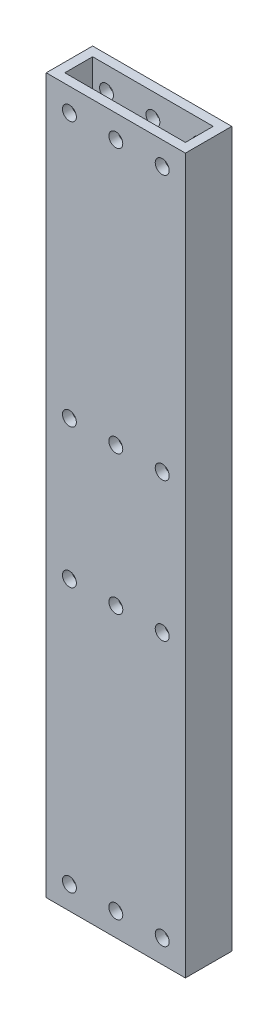
ISO-10303-21;
HEADER;
FILE_DESCRIPTION(('STEP AP214'),'2;1');
FILE_NAME('part.step','',(''),(''),'','','');
FILE_SCHEMA(('AUTOMOTIVE_DESIGN { 1 0 10303 214 1 1 1 1 }'));
ENDSEC;
DATA;
#1=APPLICATION_CONTEXT('core data for automotive mechanical design processes');
#2=APPLICATION_PROTOCOL_DEFINITION('international standard','automotive_design',2000,#1);
#3=PRODUCT_CONTEXT('',#1,'mechanical');
#4=PRODUCT('Part','Part','',(#3));
#5=PRODUCT_RELATED_PRODUCT_CATEGORY('part','',(#4));
#6=PRODUCT_DEFINITION_FORMATION('','',#4);
#7=PRODUCT_DEFINITION_CONTEXT('part definition',#1,'design');
#8=PRODUCT_DEFINITION('design','',#6,#7);
#9=PRODUCT_DEFINITION_SHAPE('','',#8);
#10=(LENGTH_UNIT() NAMED_UNIT(*) SI_UNIT(.MILLI.,.METRE.));
#11=(NAMED_UNIT(*) PLANE_ANGLE_UNIT() SI_UNIT($,.RADIAN.));
#12=(NAMED_UNIT(*) SI_UNIT($,.STERADIAN.) SOLID_ANGLE_UNIT());
#13=UNCERTAINTY_MEASURE_WITH_UNIT(LENGTH_MEASURE(1.E-05),#10,'distance_accuracy_value','');
#14=(GEOMETRIC_REPRESENTATION_CONTEXT(3) GLOBAL_UNCERTAINTY_ASSIGNED_CONTEXT((#13)) GLOBAL_UNIT_ASSIGNED_CONTEXT((#10,
#11,#12)) REPRESENTATION_CONTEXT('',''));
#15=CARTESIAN_POINT('',(0.,0.,0.));
#16=DIRECTION('',(0.,0.,1.));
#17=DIRECTION('',(1.,0.,0.));
#18=AXIS2_PLACEMENT_3D('',#15,#16,#17);
#19=CARTESIAN_POINT('',(0.,77.,0.));
#20=DIRECTION('',(0.,1.,0.));
#21=DIRECTION('',(0.,0.,1.));
#22=AXIS2_PLACEMENT_3D('',#19,#20,#21);
#23=PLANE('',#22);
#24=DIRECTION('',(0.,0.,-1.));
#25=VECTOR('',#24,1.);
#26=CARTESIAN_POINT('',(15.,77.,-5.));
#27=LINE('',#26,#25);
#28=CARTESIAN_POINT('',(15.,77.,5.));
#29=VERTEX_POINT('',#28);
#30=CARTESIAN_POINT('',(15.,77.,-5.));
#31=VERTEX_POINT('',#30);
#32=EDGE_CURVE('E156',#29,#31,#27,.T.);
#33=ORIENTED_EDGE('',*,*,#32,.T.);
#34=DIRECTION('',(-1.,0.,0.));
#35=VECTOR('',#34,1.);
#36=CARTESIAN_POINT('',(-15.,77.,-5.));
#37=LINE('',#36,#35);
#38=CARTESIAN_POINT('',(-15.,77.,-5.));
#39=VERTEX_POINT('',#38);
#40=EDGE_CURVE('E160',#31,#39,#37,.T.);
#41=ORIENTED_EDGE('',*,*,#40,.T.);
#42=DIRECTION('',(0.,0.,1.));
#43=VECTOR('',#42,1.);
#44=CARTESIAN_POINT('',(-15.,77.,-5.));
#45=LINE('',#44,#43);
#46=CARTESIAN_POINT('',(-15.,77.,5.));
#47=VERTEX_POINT('',#46);
#48=EDGE_CURVE('E164',#39,#47,#45,.T.);
#49=ORIENTED_EDGE('',*,*,#48,.T.);
#50=DIRECTION('',(1.,0.,0.));
#51=VECTOR('',#50,1.);
#52=CARTESIAN_POINT('',(-15.,77.,5.));
#53=LINE('',#52,#51);
#54=EDGE_CURVE('E167',#47,#29,#53,.T.);
#55=ORIENTED_EDGE('',*,*,#54,.T.);
#56=EDGE_LOOP('',(#33,#41,#49,#55));
#57=FACE_BOUND('',#56,.T.);
#58=DIRECTION('',(-1.,0.,0.));
#59=VECTOR('',#58,1.);
#60=CARTESIAN_POINT('',(-13.,77.,-3.));
#61=LINE('',#60,#59);
#62=CARTESIAN_POINT('',(13.,77.,-3.));
#63=VERTEX_POINT('',#62);
#64=CARTESIAN_POINT('',(-13.,77.,-3.));
#65=VERTEX_POINT('',#64);
#66=EDGE_CURVE('E115',#63,#65,#61,.T.);
#67=ORIENTED_EDGE('',*,*,#66,.F.);
#68=DIRECTION('',(0.,0.,-1.));
#69=VECTOR('',#68,1.);
#70=CARTESIAN_POINT('',(13.,77.,-3.));
#71=LINE('',#70,#69);
#72=CARTESIAN_POINT('',(13.,77.,3.));
#73=VERTEX_POINT('',#72);
#74=EDGE_CURVE('E106',#73,#63,#71,.T.);
#75=ORIENTED_EDGE('',*,*,#74,.F.);
#76=DIRECTION('',(1.,0.,0.));
#77=VECTOR('',#76,1.);
#78=CARTESIAN_POINT('',(-13.,77.,3.));
#79=LINE('',#78,#77);
#80=CARTESIAN_POINT('',(-13.,77.,3.));
#81=VERTEX_POINT('',#80);
#82=EDGE_CURVE('E132',#81,#73,#79,.T.);
#83=ORIENTED_EDGE('',*,*,#82,.F.);
#84=DIRECTION('',(0.,0.,1.));
#85=VECTOR('',#84,1.);
#86=CARTESIAN_POINT('',(-13.,77.,-3.));
#87=LINE('',#86,#85);
#88=EDGE_CURVE('E128',#65,#81,#87,.T.);
#89=ORIENTED_EDGE('',*,*,#88,.F.);
#90=EDGE_LOOP('',(#67,#75,#83,#89));
#91=FACE_BOUND('',#90,.T.);
#92=ADVANCED_FACE('F38',(#57,#91),#23,.T.);
#93=CARTESIAN_POINT('',(0.,-77.,0.));
#94=DIRECTION('',(0.,1.,0.));
#95=DIRECTION('',(0.,0.,1.));
#96=AXIS2_PLACEMENT_3D('',#93,#94,#95);
#97=PLANE('',#96);
#98=DIRECTION('',(0.,0.,-1.));
#99=VECTOR('',#98,1.);
#100=CARTESIAN_POINT('',(15.,-77.,-5.));
#101=LINE('',#100,#99);
#102=CARTESIAN_POINT('',(15.,-77.,5.));
#103=VERTEX_POINT('',#102);
#104=CARTESIAN_POINT('',(15.,-77.,-5.));
#105=VERTEX_POINT('',#104);
#106=EDGE_CURVE('E124',#103,#105,#101,.T.);
#107=ORIENTED_EDGE('',*,*,#106,.F.);
#108=DIRECTION('',(1.,0.,0.));
#109=VECTOR('',#108,1.);
#110=CARTESIAN_POINT('',(-15.,-77.,5.));
#111=LINE('',#110,#109);
#112=CARTESIAN_POINT('',(-15.,-77.,5.));
#113=VERTEX_POINT('',#112);
#114=EDGE_CURVE('E161',#113,#103,#111,.T.);
#115=ORIENTED_EDGE('',*,*,#114,.F.);
#116=DIRECTION('',(0.,0.,1.));
#117=VECTOR('',#116,1.);
#118=CARTESIAN_POINT('',(-15.,-77.,-5.));
#119=LINE('',#118,#117);
#120=CARTESIAN_POINT('',(-15.,-77.,-5.));
#121=VERTEX_POINT('',#120);
#122=EDGE_CURVE('E177',#121,#113,#119,.T.);
#123=ORIENTED_EDGE('',*,*,#122,.F.);
#124=DIRECTION('',(-1.,0.,0.));
#125=VECTOR('',#124,1.);
#126=CARTESIAN_POINT('',(-15.,-77.,-5.));
#127=LINE('',#126,#125);
#128=EDGE_CURVE('E174',#105,#121,#127,.T.);
#129=ORIENTED_EDGE('',*,*,#128,.F.);
#130=EDGE_LOOP('',(#107,#115,#123,#129));
#131=FACE_BOUND('',#130,.T.);
#132=DIRECTION('',(0.,0.,-1.));
#133=VECTOR('',#132,1.);
#134=CARTESIAN_POINT('',(13.,-77.,-3.));
#135=LINE('',#134,#133);
#136=CARTESIAN_POINT('',(13.,-77.,3.));
#137=VERTEX_POINT('',#136);
#138=CARTESIAN_POINT('',(13.,-77.,-3.));
#139=VERTEX_POINT('',#138);
#140=EDGE_CURVE('E64',#137,#139,#135,.T.);
#141=ORIENTED_EDGE('',*,*,#140,.T.);
#142=DIRECTION('',(-1.,0.,0.));
#143=VECTOR('',#142,1.);
#144=CARTESIAN_POINT('',(-13.,-77.,-3.));
#145=LINE('',#144,#143);
#146=CARTESIAN_POINT('',(-13.,-77.,-3.));
#147=VERTEX_POINT('',#146);
#148=EDGE_CURVE('E122',#139,#147,#145,.T.);
#149=ORIENTED_EDGE('',*,*,#148,.T.);
#150=DIRECTION('',(0.,0.,1.));
#151=VECTOR('',#150,1.);
#152=CARTESIAN_POINT('',(-13.,-77.,-3.));
#153=LINE('',#152,#151);
#154=CARTESIAN_POINT('',(-13.,-77.,3.));
#155=VERTEX_POINT('',#154);
#156=EDGE_CURVE('E143',#147,#155,#153,.T.);
#157=ORIENTED_EDGE('',*,*,#156,.T.);
#158=DIRECTION('',(1.,0.,0.));
#159=VECTOR('',#158,1.);
#160=CARTESIAN_POINT('',(-13.,-77.,3.));
#161=LINE('',#160,#159);
#162=EDGE_CURVE('E116',#155,#137,#161,.T.);
#163=ORIENTED_EDGE('',*,*,#162,.T.);
#164=EDGE_LOOP('',(#141,#149,#157,#163));
#165=FACE_BOUND('',#164,.T.);
#166=ADVANCED_FACE('F297',(#131,#165),#97,.F.);
#167=CARTESIAN_POINT('',(15.,77.,-5.));
#168=DIRECTION('',(-1.,0.,0.));
#169=DIRECTION('',(0.,0.,1.));
#170=AXIS2_PLACEMENT_3D('',#167,#168,#169);
#171=PLANE('',#170);
#172=ORIENTED_EDGE('',*,*,#106,.T.);
#173=DIRECTION('',(0.,-1.,0.));
#174=VECTOR('',#173,1.);
#175=CARTESIAN_POINT('',(15.,77.,-5.));
#176=LINE('',#175,#174);
#177=EDGE_CURVE('E11',#31,#105,#176,.T.);
#178=ORIENTED_EDGE('',*,*,#177,.F.);
#179=ORIENTED_EDGE('',*,*,#32,.F.);
#180=DIRECTION('',(0.,-1.,0.));
#181=VECTOR('',#180,1.);
#182=CARTESIAN_POINT('',(15.,77.,5.));
#183=LINE('',#182,#181);
#184=EDGE_CURVE('E170',#29,#103,#183,.T.);
#185=ORIENTED_EDGE('',*,*,#184,.T.);
#186=EDGE_LOOP('',(#172,#178,#179,#185));
#187=FACE_BOUND('',#186,.T.);
#188=ADVANCED_FACE('F40',(#187),#171,.F.);
#189=CARTESIAN_POINT('',(-15.,77.,-5.));
#190=DIRECTION('',(0.,0.,1.));
#191=DIRECTION('',(1.,0.,0.));
#192=AXIS2_PLACEMENT_3D('',#189,#190,#191);
#193=PLANE('',#192);
#194=CARTESIAN_POINT('',(10.,-72.,-5.));
#195=DIRECTION('',(0.,0.,1.));
#196=DIRECTION('',(-1.,0.,0.));
#197=AXIS2_PLACEMENT_3D('',#194,#195,#196);
#198=CIRCLE('',#197,1.5);
#199=CARTESIAN_POINT('',(8.5,-72.,-5.));
#200=VERTEX_POINT('',#199);
#201=EDGE_CURVE('E335',#200,#200,#198,.T.);
#202=ORIENTED_EDGE('',*,*,#201,.T.);
#203=EDGE_LOOP('',(#202));
#204=FACE_BOUND('',#203,.T.);
#205=CARTESIAN_POINT('',(0.,-72.,-5.));
#206=DIRECTION('',(0.,0.,1.));
#207=DIRECTION('',(-1.,0.,0.));
#208=AXIS2_PLACEMENT_3D('',#205,#206,#207);
#209=CIRCLE('',#208,1.5);
#210=CARTESIAN_POINT('',(-1.5,-72.,-5.));
#211=VERTEX_POINT('',#210);
#212=EDGE_CURVE('E339',#211,#211,#209,.T.);
#213=ORIENTED_EDGE('',*,*,#212,.T.);
#214=EDGE_LOOP('',(#213));
#215=FACE_BOUND('',#214,.T.);
#216=CARTESIAN_POINT('',(-10.,-72.,-5.));
#217=DIRECTION('',(0.,0.,1.));
#218=DIRECTION('',(-1.,0.,0.));
#219=AXIS2_PLACEMENT_3D('',#216,#217,#218);
#220=CIRCLE('',#219,1.5);
#221=CARTESIAN_POINT('',(-11.5,-72.,-5.));
#222=VERTEX_POINT('',#221);
#223=EDGE_CURVE('E343',#222,#222,#220,.T.);
#224=ORIENTED_EDGE('',*,*,#223,.T.);
#225=EDGE_LOOP('',(#224));
#226=FACE_BOUND('',#225,.T.);
#227=CARTESIAN_POINT('',(-10.,14.9999999999978,-5.));
#228=DIRECTION('',(0.,0.,1.));
#229=DIRECTION('',(1.,0.,0.));
#230=AXIS2_PLACEMENT_3D('',#227,#228,#229);
#231=CIRCLE('',#230,1.50000000000068);
#232=CARTESIAN_POINT('',(-8.49999999999931,14.9999999999978,-5.));
#233=VERTEX_POINT('',#232);
#234=EDGE_CURVE('E347',#233,#233,#231,.T.);
#235=ORIENTED_EDGE('',*,*,#234,.T.);
#236=EDGE_LOOP('',(#235));
#237=FACE_BOUND('',#236,.T.);
#238=CARTESIAN_POINT('',(0.,14.9999999999978,-5.));
#239=DIRECTION('',(0.,0.,1.));
#240=DIRECTION('',(1.,0.,0.));
#241=AXIS2_PLACEMENT_3D('',#238,#239,#240);
#242=CIRCLE('',#241,1.5000000000006);
#243=CARTESIAN_POINT('',(1.50000000000062,14.9999999999978,-5.));
#244=VERTEX_POINT('',#243);
#245=EDGE_CURVE('E351',#244,#244,#242,.T.);
#246=ORIENTED_EDGE('',*,*,#245,.T.);
#247=EDGE_LOOP('',(#246));
#248=FACE_BOUND('',#247,.T.);
#249=CARTESIAN_POINT('',(10.,-14.9999999999978,-5.));
#250=DIRECTION('',(0.,0.,1.));
#251=DIRECTION('',(-1.,0.,0.));
#252=AXIS2_PLACEMENT_3D('',#249,#250,#251);
#253=CIRCLE('',#252,1.50000000000068);
#254=CARTESIAN_POINT('',(8.49999999999931,-14.9999999999978,-5.));
#255=VERTEX_POINT('',#254);
#256=EDGE_CURVE('E355',#255,#255,#253,.T.);
#257=ORIENTED_EDGE('',*,*,#256,.T.);
#258=EDGE_LOOP('',(#257));
#259=FACE_BOUND('',#258,.T.);
#260=CARTESIAN_POINT('',(0.,-14.9999999999978,-5.));
#261=DIRECTION('',(0.,0.,1.));
#262=DIRECTION('',(-1.,0.,0.));
#263=AXIS2_PLACEMENT_3D('',#260,#261,#262);
#264=CIRCLE('',#263,1.5000000000006);
#265=CARTESIAN_POINT('',(-1.50000000000059,-14.9999999999978,-5.));
#266=VERTEX_POINT('',#265);
#267=EDGE_CURVE('E359',#266,#266,#264,.T.);
#268=ORIENTED_EDGE('',*,*,#267,.T.);
#269=EDGE_LOOP('',(#268));
#270=FACE_BOUND('',#269,.T.);
#271=CARTESIAN_POINT('',(0.,72.,-5.));
#272=DIRECTION('',(0.,0.,1.));
#273=DIRECTION('',(1.,0.,0.));
#274=AXIS2_PLACEMENT_3D('',#271,#272,#273);
#275=CIRCLE('',#274,1.5);
#276=CARTESIAN_POINT('',(1.5,72.,-5.));
#277=VERTEX_POINT('',#276);
#278=EDGE_CURVE('E363',#277,#277,#275,.T.);
#279=ORIENTED_EDGE('',*,*,#278,.T.);
#280=EDGE_LOOP('',(#279));
#281=FACE_BOUND('',#280,.T.);
#282=CARTESIAN_POINT('',(-10.,72.,-5.));
#283=DIRECTION('',(0.,0.,1.));
#284=DIRECTION('',(1.,0.,0.));
#285=AXIS2_PLACEMENT_3D('',#282,#283,#284);
#286=CIRCLE('',#285,1.5);
#287=CARTESIAN_POINT('',(-8.5,72.,-5.));
#288=VERTEX_POINT('',#287);
#289=EDGE_CURVE('E367',#288,#288,#286,.T.);
#290=ORIENTED_EDGE('',*,*,#289,.T.);
#291=EDGE_LOOP('',(#290));
#292=FACE_BOUND('',#291,.T.);
#293=CARTESIAN_POINT('',(10.,72.,-5.));
#294=DIRECTION('',(0.,0.,1.));
#295=DIRECTION('',(1.,0.,0.));
#296=AXIS2_PLACEMENT_3D('',#293,#294,#295);
#297=CIRCLE('',#296,1.5);
#298=CARTESIAN_POINT('',(11.5,72.,-5.));
#299=VERTEX_POINT('',#298);
#300=EDGE_CURVE('E371',#299,#299,#297,.T.);
#301=ORIENTED_EDGE('',*,*,#300,.T.);
#302=EDGE_LOOP('',(#301));
#303=FACE_BOUND('',#302,.T.);
#304=CARTESIAN_POINT('',(-10.,-14.9999999999978,-5.));
#305=DIRECTION('',(0.,0.,1.));
#306=DIRECTION('',(-1.,0.,0.));
#307=AXIS2_PLACEMENT_3D('',#304,#305,#306);
#308=CIRCLE('',#307,1.50000000000068);
#309=CARTESIAN_POINT('',(-11.5000000000007,-14.9999999999978,-5.));
#310=VERTEX_POINT('',#309);
#311=EDGE_CURVE('E375',#310,#310,#308,.T.);
#312=ORIENTED_EDGE('',*,*,#311,.T.);
#313=EDGE_LOOP('',(#312));
#314=FACE_BOUND('',#313,.T.);
#315=CARTESIAN_POINT('',(10.,14.9999999999978,-5.));
#316=DIRECTION('',(0.,0.,1.));
#317=DIRECTION('',(1.,0.,0.));
#318=AXIS2_PLACEMENT_3D('',#315,#316,#317);
#319=CIRCLE('',#318,1.50000000000068);
#320=CARTESIAN_POINT('',(11.5000000000007,14.9999999999978,-5.));
#321=VERTEX_POINT('',#320);
#322=EDGE_CURVE('E197',#321,#321,#319,.T.);
#323=ORIENTED_EDGE('',*,*,#322,.T.);
#324=EDGE_LOOP('',(#323));
#325=FACE_BOUND('',#324,.T.);
#326=ORIENTED_EDGE('',*,*,#128,.T.);
#327=DIRECTION('',(0.,-1.,0.));
#328=VECTOR('',#327,1.);
#329=CARTESIAN_POINT('',(-15.,77.,-5.));
#330=LINE('',#329,#328);
#331=EDGE_CURVE('E48',#39,#121,#330,.T.);
#332=ORIENTED_EDGE('',*,*,#331,.F.);
#333=ORIENTED_EDGE('',*,*,#40,.F.);
#334=ORIENTED_EDGE('',*,*,#177,.T.);
#335=EDGE_LOOP('',(#326,#332,#333,#334));
#336=FACE_BOUND('',#335,.T.);
#337=ADVANCED_FACE('F324',(#204,#215,#226,#237,#248,#259,#270,#281,#292,#303,#314,#325,#336),
#193,.F.);
#338=CARTESIAN_POINT('',(-15.,77.,-5.));
#339=DIRECTION('',(1.,0.,0.));
#340=DIRECTION('',(0.,0.,-1.));
#341=AXIS2_PLACEMENT_3D('',#338,#339,#340);
#342=PLANE('',#341);
#343=ORIENTED_EDGE('',*,*,#122,.T.);
#344=DIRECTION('',(0.,-1.,0.));
#345=VECTOR('',#344,1.);
#346=CARTESIAN_POINT('',(-15.,77.,5.));
#347=LINE('',#346,#345);
#348=EDGE_CURVE('E185',#47,#113,#347,.T.);
#349=ORIENTED_EDGE('',*,*,#348,.F.);
#350=ORIENTED_EDGE('',*,*,#48,.F.);
#351=ORIENTED_EDGE('',*,*,#331,.T.);
#352=EDGE_LOOP('',(#343,#349,#350,#351));
#353=FACE_BOUND('',#352,.T.);
#354=ADVANCED_FACE('F321',(#353),#342,.F.);
#355=CARTESIAN_POINT('',(-15.,77.,5.));
#356=DIRECTION('',(0.,0.,-1.));
#357=DIRECTION('',(-1.,0.,0.));
#358=AXIS2_PLACEMENT_3D('',#355,#356,#357);
#359=PLANE('',#358);
#360=CARTESIAN_POINT('',(10.,-72.,5.));
#361=DIRECTION('',(0.,0.,1.));
#362=DIRECTION('',(-1.,0.,0.));
#363=AXIS2_PLACEMENT_3D('',#360,#361,#362);
#364=CIRCLE('',#363,1.5);
#365=CARTESIAN_POINT('',(8.5,-72.,5.));
#366=VERTEX_POINT('',#365);
#367=EDGE_CURVE('E398',#366,#366,#364,.T.);
#368=ORIENTED_EDGE('',*,*,#367,.F.);
#369=EDGE_LOOP('',(#368));
#370=FACE_BOUND('',#369,.T.);
#371=CARTESIAN_POINT('',(0.,-72.,5.));
#372=DIRECTION('',(0.,0.,1.));
#373=DIRECTION('',(-1.,0.,0.));
#374=AXIS2_PLACEMENT_3D('',#371,#372,#373);
#375=CIRCLE('',#374,1.5);
#376=CARTESIAN_POINT('',(-1.5,-72.,5.));
#377=VERTEX_POINT('',#376);
#378=EDGE_CURVE('E518',#377,#377,#375,.T.);
#379=ORIENTED_EDGE('',*,*,#378,.F.);
#380=EDGE_LOOP('',(#379));
#381=FACE_BOUND('',#380,.T.);
#382=CARTESIAN_POINT('',(-10.,-72.,5.));
#383=DIRECTION('',(0.,0.,1.));
#384=DIRECTION('',(-1.,0.,0.));
#385=AXIS2_PLACEMENT_3D('',#382,#383,#384);
#386=CIRCLE('',#385,1.5);
#387=CARTESIAN_POINT('',(-11.5,-72.,5.));
#388=VERTEX_POINT('',#387);
#389=EDGE_CURVE('E517',#388,#388,#386,.T.);
#390=ORIENTED_EDGE('',*,*,#389,.F.);
#391=EDGE_LOOP('',(#390));
#392=FACE_BOUND('',#391,.T.);
#393=CARTESIAN_POINT('',(-10.,14.9999999999978,5.));
#394=DIRECTION('',(0.,0.,1.));
#395=DIRECTION('',(1.,0.,0.));
#396=AXIS2_PLACEMENT_3D('',#393,#394,#395);
#397=CIRCLE('',#396,1.50000000000068);
#398=CARTESIAN_POINT('',(-8.49999999999931,14.9999999999978,5.));
#399=VERTEX_POINT('',#398);
#400=EDGE_CURVE('E539',#399,#399,#397,.T.);
#401=ORIENTED_EDGE('',*,*,#400,.F.);
#402=EDGE_LOOP('',(#401));
#403=FACE_BOUND('',#402,.T.);
#404=CARTESIAN_POINT('',(0.,14.9999999999978,5.));
#405=DIRECTION('',(0.,0.,1.));
#406=DIRECTION('',(1.,0.,0.));
#407=AXIS2_PLACEMENT_3D('',#404,#405,#406);
#408=CIRCLE('',#407,1.5000000000006);
#409=CARTESIAN_POINT('',(1.50000000000062,14.9999999999978,5.));
#410=VERTEX_POINT('',#409);
#411=EDGE_CURVE('E543',#410,#410,#408,.T.);
#412=ORIENTED_EDGE('',*,*,#411,.F.);
#413=EDGE_LOOP('',(#412));
#414=FACE_BOUND('',#413,.T.);
#415=CARTESIAN_POINT('',(10.,-14.9999999999978,5.));
#416=DIRECTION('',(0.,0.,1.));
#417=DIRECTION('',(-1.,0.,0.));
#418=AXIS2_PLACEMENT_3D('',#415,#416,#417);
#419=CIRCLE('',#418,1.50000000000068);
#420=CARTESIAN_POINT('',(8.49999999999931,-14.9999999999978,5.));
#421=VERTEX_POINT('',#420);
#422=EDGE_CURVE('E547',#421,#421,#419,.T.);
#423=ORIENTED_EDGE('',*,*,#422,.F.);
#424=EDGE_LOOP('',(#423));
#425=FACE_BOUND('',#424,.T.);
#426=CARTESIAN_POINT('',(0.,-14.9999999999978,5.));
#427=DIRECTION('',(0.,0.,1.));
#428=DIRECTION('',(-1.,0.,0.));
#429=AXIS2_PLACEMENT_3D('',#426,#427,#428);
#430=CIRCLE('',#429,1.5000000000006);
#431=CARTESIAN_POINT('',(-1.50000000000059,-14.9999999999978,5.));
#432=VERTEX_POINT('',#431);
#433=EDGE_CURVE('E551',#432,#432,#430,.T.);
#434=ORIENTED_EDGE('',*,*,#433,.F.);
#435=EDGE_LOOP('',(#434));
#436=FACE_BOUND('',#435,.T.);
#437=CARTESIAN_POINT('',(0.,72.,5.));
#438=DIRECTION('',(0.,0.,1.));
#439=DIRECTION('',(1.,0.,0.));
#440=AXIS2_PLACEMENT_3D('',#437,#438,#439);
#441=CIRCLE('',#440,1.5);
#442=CARTESIAN_POINT('',(1.5,72.,5.));
#443=VERTEX_POINT('',#442);
#444=EDGE_CURVE('E555',#443,#443,#441,.T.);
#445=ORIENTED_EDGE('',*,*,#444,.F.);
#446=EDGE_LOOP('',(#445));
#447=FACE_BOUND('',#446,.T.);
#448=CARTESIAN_POINT('',(-10.,72.,5.));
#449=DIRECTION('',(0.,0.,1.));
#450=DIRECTION('',(1.,0.,0.));
#451=AXIS2_PLACEMENT_3D('',#448,#449,#450);
#452=CIRCLE('',#451,1.5);
#453=CARTESIAN_POINT('',(-8.5,72.,5.));
#454=VERTEX_POINT('',#453);
#455=EDGE_CURVE('E559',#454,#454,#452,.T.);
#456=ORIENTED_EDGE('',*,*,#455,.F.);
#457=EDGE_LOOP('',(#456));
#458=FACE_BOUND('',#457,.T.);
#459=CARTESIAN_POINT('',(10.,72.,5.));
#460=DIRECTION('',(0.,0.,1.));
#461=DIRECTION('',(1.,0.,0.));
#462=AXIS2_PLACEMENT_3D('',#459,#460,#461);
#463=CIRCLE('',#462,1.5);
#464=CARTESIAN_POINT('',(11.5,72.,5.));
#465=VERTEX_POINT('',#464);
#466=EDGE_CURVE('E563',#465,#465,#463,.T.);
#467=ORIENTED_EDGE('',*,*,#466,.F.);
#468=EDGE_LOOP('',(#467));
#469=FACE_BOUND('',#468,.T.);
#470=CARTESIAN_POINT('',(-10.,-14.9999999999978,5.));
#471=DIRECTION('',(0.,0.,1.));
#472=DIRECTION('',(-1.,0.,0.));
#473=AXIS2_PLACEMENT_3D('',#470,#471,#472);
#474=CIRCLE('',#473,1.50000000000068);
#475=CARTESIAN_POINT('',(-11.5000000000007,-14.9999999999978,5.));
#476=VERTEX_POINT('',#475);
#477=EDGE_CURVE('E566',#476,#476,#474,.T.);
#478=ORIENTED_EDGE('',*,*,#477,.F.);
#479=EDGE_LOOP('',(#478));
#480=FACE_BOUND('',#479,.T.);
#481=CARTESIAN_POINT('',(10.,14.9999999999978,5.));
#482=DIRECTION('',(0.,0.,1.));
#483=DIRECTION('',(1.,0.,0.));
#484=AXIS2_PLACEMENT_3D('',#481,#482,#483);
#485=CIRCLE('',#484,1.50000000000068);
#486=CARTESIAN_POINT('',(11.5000000000007,14.9999999999978,5.));
#487=VERTEX_POINT('',#486);
#488=EDGE_CURVE('E392',#487,#487,#485,.T.);
#489=ORIENTED_EDGE('',*,*,#488,.F.);
#490=EDGE_LOOP('',(#489));
#491=FACE_BOUND('',#490,.T.);
#492=ORIENTED_EDGE('',*,*,#114,.T.);
#493=ORIENTED_EDGE('',*,*,#184,.F.);
#494=ORIENTED_EDGE('',*,*,#54,.F.);
#495=ORIENTED_EDGE('',*,*,#348,.T.);
#496=EDGE_LOOP('',(#492,#493,#494,#495));
#497=FACE_BOUND('',#496,.T.);
#498=ADVANCED_FACE('F318',(#370,#381,#392,#403,#414,#425,#436,#447,#458,#469,#480,#491,#497),
#359,.F.);
#499=CARTESIAN_POINT('',(13.,77.,-3.));
#500=DIRECTION('',(-1.,0.,0.));
#501=DIRECTION('',(0.,0.,1.));
#502=AXIS2_PLACEMENT_3D('',#499,#500,#501);
#503=PLANE('',#502);
#504=ORIENTED_EDGE('',*,*,#140,.F.);
#505=DIRECTION('',(0.,-1.,0.));
#506=VECTOR('',#505,1.);
#507=CARTESIAN_POINT('',(13.,77.,3.));
#508=LINE('',#507,#506);
#509=EDGE_CURVE('E110',#73,#137,#508,.T.);
#510=ORIENTED_EDGE('',*,*,#509,.F.);
#511=ORIENTED_EDGE('',*,*,#74,.T.);
#512=DIRECTION('',(0.,-1.,0.));
#513=VECTOR('',#512,1.);
#514=CARTESIAN_POINT('',(13.,77.,-3.));
#515=LINE('',#514,#513);
#516=EDGE_CURVE('E109',#63,#139,#515,.T.);
#517=ORIENTED_EDGE('',*,*,#516,.T.);
#518=EDGE_LOOP('',(#504,#510,#511,#517));
#519=FACE_BOUND('',#518,.T.);
#520=ADVANCED_FACE('F108',(#519),#503,.T.);
#521=CARTESIAN_POINT('',(-13.,77.,-3.));
#522=DIRECTION('',(0.,0.,1.));
#523=DIRECTION('',(1.,0.,0.));
#524=AXIS2_PLACEMENT_3D('',#521,#522,#523);
#525=PLANE('',#524);
#526=CARTESIAN_POINT('',(10.,-72.,-3.));
#527=DIRECTION('',(0.,0.,1.));
#528=DIRECTION('',(1.,0.,0.));
#529=AXIS2_PLACEMENT_3D('',#526,#527,#528);
#530=CIRCLE('',#529,1.5);
#531=CARTESIAN_POINT('',(11.5,-72.,-3.));
#532=VERTEX_POINT('',#531);
#533=EDGE_CURVE('E140',#532,#532,#530,.T.);
#534=ORIENTED_EDGE('',*,*,#533,.F.);
#535=EDGE_LOOP('',(#534));
#536=FACE_BOUND('',#535,.T.);
#537=CARTESIAN_POINT('',(0.,-72.,-3.));
#538=DIRECTION('',(0.,0.,1.));
#539=DIRECTION('',(1.,0.,0.));
#540=AXIS2_PLACEMENT_3D('',#537,#538,#539);
#541=CIRCLE('',#540,1.5);
#542=CARTESIAN_POINT('',(1.5,-72.,-3.));
#543=VERTEX_POINT('',#542);
#544=EDGE_CURVE('E245',#543,#543,#541,.T.);
#545=ORIENTED_EDGE('',*,*,#544,.F.);
#546=EDGE_LOOP('',(#545));
#547=FACE_BOUND('',#546,.T.);
#548=CARTESIAN_POINT('',(-10.,-72.,-3.));
#549=DIRECTION('',(0.,0.,1.));
#550=DIRECTION('',(1.,0.,0.));
#551=AXIS2_PLACEMENT_3D('',#548,#549,#550);
#552=CIRCLE('',#551,1.5);
#553=CARTESIAN_POINT('',(-8.5,-72.,-3.));
#554=VERTEX_POINT('',#553);
#555=EDGE_CURVE('E241',#554,#554,#552,.T.);
#556=ORIENTED_EDGE('',*,*,#555,.F.);
#557=EDGE_LOOP('',(#556));
#558=FACE_BOUND('',#557,.T.);
#559=CARTESIAN_POINT('',(-10.,14.9999999999978,-3.));
#560=DIRECTION('',(0.,0.,1.));
#561=DIRECTION('',(1.,0.,0.));
#562=AXIS2_PLACEMENT_3D('',#559,#560,#561);
#563=CIRCLE('',#562,1.50000000000068);
#564=CARTESIAN_POINT('',(-8.49999999999931,14.9999999999978,-3.));
#565=VERTEX_POINT('',#564);
#566=EDGE_CURVE('E237',#565,#565,#563,.T.);
#567=ORIENTED_EDGE('',*,*,#566,.F.);
#568=EDGE_LOOP('',(#567));
#569=FACE_BOUND('',#568,.T.);
#570=CARTESIAN_POINT('',(0.,14.9999999999978,-3.));
#571=DIRECTION('',(0.,0.,1.));
#572=DIRECTION('',(1.,0.,0.));
#573=AXIS2_PLACEMENT_3D('',#570,#571,#572);
#574=CIRCLE('',#573,1.5000000000006);
#575=CARTESIAN_POINT('',(1.50000000000062,14.9999999999978,-3.));
#576=VERTEX_POINT('',#575);
#577=EDGE_CURVE('E232',#576,#576,#574,.T.);
#578=ORIENTED_EDGE('',*,*,#577,.F.);
#579=EDGE_LOOP('',(#578));
#580=FACE_BOUND('',#579,.T.);
#581=CARTESIAN_POINT('',(10.,-14.9999999999978,-3.));
#582=DIRECTION('',(0.,0.,1.));
#583=DIRECTION('',(1.,0.,0.));
#584=AXIS2_PLACEMENT_3D('',#581,#582,#583);
#585=CIRCLE('',#584,1.50000000000068);
#586=CARTESIAN_POINT('',(11.5000000000007,-14.9999999999978,-3.));
#587=VERTEX_POINT('',#586);
#588=EDGE_CURVE('E227',#587,#587,#585,.T.);
#589=ORIENTED_EDGE('',*,*,#588,.F.);
#590=EDGE_LOOP('',(#589));
#591=FACE_BOUND('',#590,.T.);
#592=CARTESIAN_POINT('',(0.,-14.9999999999978,-3.));
#593=DIRECTION('',(0.,0.,1.));
#594=DIRECTION('',(1.,0.,0.));
#595=AXIS2_PLACEMENT_3D('',#592,#593,#594);
#596=CIRCLE('',#595,1.5000000000006);
#597=CARTESIAN_POINT('',(1.50000000000062,-14.9999999999978,-3.));
#598=VERTEX_POINT('',#597);
#599=EDGE_CURVE('E222',#598,#598,#596,.T.);
#600=ORIENTED_EDGE('',*,*,#599,.F.);
#601=EDGE_LOOP('',(#600));
#602=FACE_BOUND('',#601,.T.);
#603=CARTESIAN_POINT('',(0.,72.,-3.));
#604=DIRECTION('',(0.,0.,1.));
#605=DIRECTION('',(1.,0.,0.));
#606=AXIS2_PLACEMENT_3D('',#603,#604,#605);
#607=CIRCLE('',#606,1.5);
#608=CARTESIAN_POINT('',(1.5,72.,-3.));
#609=VERTEX_POINT('',#608);
#610=EDGE_CURVE('E217',#609,#609,#607,.T.);
#611=ORIENTED_EDGE('',*,*,#610,.F.);
#612=EDGE_LOOP('',(#611));
#613=FACE_BOUND('',#612,.T.);
#614=CARTESIAN_POINT('',(-10.,72.,-3.));
#615=DIRECTION('',(0.,0.,1.));
#616=DIRECTION('',(1.,0.,0.));
#617=AXIS2_PLACEMENT_3D('',#614,#615,#616);
#618=CIRCLE('',#617,1.5);
#619=CARTESIAN_POINT('',(-8.5,72.,-3.));
#620=VERTEX_POINT('',#619);
#621=EDGE_CURVE('E212',#620,#620,#618,.T.);
#622=ORIENTED_EDGE('',*,*,#621,.F.);
#623=EDGE_LOOP('',(#622));
#624=FACE_BOUND('',#623,.T.);
#625=CARTESIAN_POINT('',(10.,72.,-3.));
#626=DIRECTION('',(0.,0.,1.));
#627=DIRECTION('',(1.,0.,0.));
#628=AXIS2_PLACEMENT_3D('',#625,#626,#627);
#629=CIRCLE('',#628,1.5);
#630=CARTESIAN_POINT('',(11.5,72.,-3.));
#631=VERTEX_POINT('',#630);
#632=EDGE_CURVE('E207',#631,#631,#629,.T.);
#633=ORIENTED_EDGE('',*,*,#632,.F.);
#634=EDGE_LOOP('',(#633));
#635=FACE_BOUND('',#634,.T.);
#636=CARTESIAN_POINT('',(-10.,-14.9999999999978,-3.));
#637=DIRECTION('',(0.,0.,1.));
#638=DIRECTION('',(1.,0.,0.));
#639=AXIS2_PLACEMENT_3D('',#636,#637,#638);
#640=CIRCLE('',#639,1.50000000000068);
#641=CARTESIAN_POINT('',(-8.49999999999931,-14.9999999999978,-3.));
#642=VERTEX_POINT('',#641);
#643=EDGE_CURVE('E202',#642,#642,#640,.T.);
#644=ORIENTED_EDGE('',*,*,#643,.F.);
#645=EDGE_LOOP('',(#644));
#646=FACE_BOUND('',#645,.T.);
#647=CARTESIAN_POINT('',(10.,14.9999999999978,-3.));
#648=DIRECTION('',(0.,0.,1.));
#649=DIRECTION('',(1.,0.,0.));
#650=AXIS2_PLACEMENT_3D('',#647,#648,#649);
#651=CIRCLE('',#650,1.50000000000068);
#652=CARTESIAN_POINT('',(11.5000000000007,14.9999999999978,-3.));
#653=VERTEX_POINT('',#652);
#654=EDGE_CURVE('E196',#653,#653,#651,.T.);
#655=ORIENTED_EDGE('',*,*,#654,.F.);
#656=EDGE_LOOP('',(#655));
#657=FACE_BOUND('',#656,.T.);
#658=ORIENTED_EDGE('',*,*,#148,.F.);
#659=ORIENTED_EDGE('',*,*,#516,.F.);
#660=ORIENTED_EDGE('',*,*,#66,.T.);
#661=DIRECTION('',(0.,-1.,0.));
#662=VECTOR('',#661,1.);
#663=CARTESIAN_POINT('',(-13.,77.,-3.));
#664=LINE('',#663,#662);
#665=EDGE_CURVE('E125',#65,#147,#664,.T.);
#666=ORIENTED_EDGE('',*,*,#665,.T.);
#667=EDGE_LOOP('',(#658,#659,#660,#666));
#668=FACE_BOUND('',#667,.T.);
#669=ADVANCED_FACE('F119',(#536,#547,#558,#569,#580,#591,#602,#613,#624,#635,#646,#657,#668),
#525,.T.);
#670=CARTESIAN_POINT('',(-13.,77.,-3.));
#671=DIRECTION('',(1.,0.,0.));
#672=DIRECTION('',(0.,0.,-1.));
#673=AXIS2_PLACEMENT_3D('',#670,#671,#672);
#674=PLANE('',#673);
#675=ORIENTED_EDGE('',*,*,#156,.F.);
#676=ORIENTED_EDGE('',*,*,#665,.F.);
#677=ORIENTED_EDGE('',*,*,#88,.T.);
#678=DIRECTION('',(0.,-1.,0.));
#679=VECTOR('',#678,1.);
#680=CARTESIAN_POINT('',(-13.,77.,3.));
#681=LINE('',#680,#679);
#682=EDGE_CURVE('E56',#81,#155,#681,.T.);
#683=ORIENTED_EDGE('',*,*,#682,.T.);
#684=EDGE_LOOP('',(#675,#676,#677,#683));
#685=FACE_BOUND('',#684,.T.);
#686=ADVANCED_FACE('F273',(#685),#674,.T.);
#687=CARTESIAN_POINT('',(-13.,77.,3.));
#688=DIRECTION('',(0.,0.,-1.));
#689=DIRECTION('',(-1.,0.,0.));
#690=AXIS2_PLACEMENT_3D('',#687,#688,#689);
#691=PLANE('',#690);
#692=CARTESIAN_POINT('',(10.,-72.,3.));
#693=DIRECTION('',(0.,0.,-1.));
#694=DIRECTION('',(-1.,0.,0.));
#695=AXIS2_PLACEMENT_3D('',#692,#693,#694);
#696=CIRCLE('',#695,1.5);
#697=CARTESIAN_POINT('',(8.5,-72.,3.));
#698=VERTEX_POINT('',#697);
#699=EDGE_CURVE('E42',#698,#698,#696,.T.);
#700=ORIENTED_EDGE('',*,*,#699,.F.);
#701=EDGE_LOOP('',(#700));
#702=FACE_BOUND('',#701,.T.);
#703=CARTESIAN_POINT('',(0.,-72.,3.));
#704=DIRECTION('',(0.,0.,-1.));
#705=DIRECTION('',(-1.,0.,0.));
#706=AXIS2_PLACEMENT_3D('',#703,#704,#705);
#707=CIRCLE('',#706,1.5);
#708=CARTESIAN_POINT('',(-1.5,-72.,3.));
#709=VERTEX_POINT('',#708);
#710=EDGE_CURVE('E242',#709,#709,#707,.T.);
#711=ORIENTED_EDGE('',*,*,#710,.F.);
#712=EDGE_LOOP('',(#711));
#713=FACE_BOUND('',#712,.T.);
#714=CARTESIAN_POINT('',(-10.,-72.,3.));
#715=DIRECTION('',(0.,0.,-1.));
#716=DIRECTION('',(-1.,0.,0.));
#717=AXIS2_PLACEMENT_3D('',#714,#715,#716);
#718=CIRCLE('',#717,1.5);
#719=CARTESIAN_POINT('',(-11.5,-72.,3.));
#720=VERTEX_POINT('',#719);
#721=EDGE_CURVE('E238',#720,#720,#718,.T.);
#722=ORIENTED_EDGE('',*,*,#721,.F.);
#723=EDGE_LOOP('',(#722));
#724=FACE_BOUND('',#723,.T.);
#725=CARTESIAN_POINT('',(-10.,14.9999999999978,3.));
#726=DIRECTION('',(0.,0.,-1.));
#727=DIRECTION('',(-1.,0.,0.));
#728=AXIS2_PLACEMENT_3D('',#725,#726,#727);
#729=CIRCLE('',#728,1.50000000000068);
#730=CARTESIAN_POINT('',(-11.5000000000007,14.9999999999978,3.));
#731=VERTEX_POINT('',#730);
#732=EDGE_CURVE('E233',#731,#731,#729,.T.);
#733=ORIENTED_EDGE('',*,*,#732,.F.);
#734=EDGE_LOOP('',(#733));
#735=FACE_BOUND('',#734,.T.);
#736=CARTESIAN_POINT('',(0.,14.9999999999978,3.));
#737=DIRECTION('',(0.,0.,-1.));
#738=DIRECTION('',(-1.,0.,0.));
#739=AXIS2_PLACEMENT_3D('',#736,#737,#738);
#740=CIRCLE('',#739,1.5000000000006);
#741=CARTESIAN_POINT('',(-1.50000000000059,14.9999999999978,3.));
#742=VERTEX_POINT('',#741);
#743=EDGE_CURVE('E228',#742,#742,#740,.T.);
#744=ORIENTED_EDGE('',*,*,#743,.F.);
#745=EDGE_LOOP('',(#744));
#746=FACE_BOUND('',#745,.T.);
#747=CARTESIAN_POINT('',(10.,-14.9999999999978,3.));
#748=DIRECTION('',(0.,0.,-1.));
#749=DIRECTION('',(-1.,0.,0.));
#750=AXIS2_PLACEMENT_3D('',#747,#748,#749);
#751=CIRCLE('',#750,1.50000000000068);
#752=CARTESIAN_POINT('',(8.49999999999931,-14.9999999999978,3.));
#753=VERTEX_POINT('',#752);
#754=EDGE_CURVE('E223',#753,#753,#751,.T.);
#755=ORIENTED_EDGE('',*,*,#754,.F.);
#756=EDGE_LOOP('',(#755));
#757=FACE_BOUND('',#756,.T.);
#758=CARTESIAN_POINT('',(0.,-14.9999999999978,3.));
#759=DIRECTION('',(0.,0.,-1.));
#760=DIRECTION('',(-1.,0.,0.));
#761=AXIS2_PLACEMENT_3D('',#758,#759,#760);
#762=CIRCLE('',#761,1.5000000000006);
#763=CARTESIAN_POINT('',(-1.50000000000059,-14.9999999999978,3.));
#764=VERTEX_POINT('',#763);
#765=EDGE_CURVE('E218',#764,#764,#762,.T.);
#766=ORIENTED_EDGE('',*,*,#765,.F.);
#767=EDGE_LOOP('',(#766));
#768=FACE_BOUND('',#767,.T.);
#769=CARTESIAN_POINT('',(0.,72.,3.));
#770=DIRECTION('',(0.,0.,-1.));
#771=DIRECTION('',(-1.,0.,0.));
#772=AXIS2_PLACEMENT_3D('',#769,#770,#771);
#773=CIRCLE('',#772,1.5);
#774=CARTESIAN_POINT('',(-1.5,72.,3.));
#775=VERTEX_POINT('',#774);
#776=EDGE_CURVE('E213',#775,#775,#773,.T.);
#777=ORIENTED_EDGE('',*,*,#776,.F.);
#778=EDGE_LOOP('',(#777));
#779=FACE_BOUND('',#778,.T.);
#780=CARTESIAN_POINT('',(-10.,72.,3.));
#781=DIRECTION('',(0.,0.,-1.));
#782=DIRECTION('',(-1.,0.,0.));
#783=AXIS2_PLACEMENT_3D('',#780,#781,#782);
#784=CIRCLE('',#783,1.5);
#785=CARTESIAN_POINT('',(-11.5,72.,3.));
#786=VERTEX_POINT('',#785);
#787=EDGE_CURVE('E208',#786,#786,#784,.T.);
#788=ORIENTED_EDGE('',*,*,#787,.F.);
#789=EDGE_LOOP('',(#788));
#790=FACE_BOUND('',#789,.T.);
#791=CARTESIAN_POINT('',(10.,72.,3.));
#792=DIRECTION('',(0.,0.,-1.));
#793=DIRECTION('',(-1.,0.,0.));
#794=AXIS2_PLACEMENT_3D('',#791,#792,#793);
#795=CIRCLE('',#794,1.5);
#796=CARTESIAN_POINT('',(8.5,72.,3.));
#797=VERTEX_POINT('',#796);
#798=EDGE_CURVE('E203',#797,#797,#795,.T.);
#799=ORIENTED_EDGE('',*,*,#798,.F.);
#800=EDGE_LOOP('',(#799));
#801=FACE_BOUND('',#800,.T.);
#802=CARTESIAN_POINT('',(-10.,-14.9999999999978,3.));
#803=DIRECTION('',(0.,0.,-1.));
#804=DIRECTION('',(-1.,0.,0.));
#805=AXIS2_PLACEMENT_3D('',#802,#803,#804);
#806=CIRCLE('',#805,1.50000000000068);
#807=CARTESIAN_POINT('',(-11.5000000000007,-14.9999999999978,3.));
#808=VERTEX_POINT('',#807);
#809=EDGE_CURVE('E198',#808,#808,#806,.T.);
#810=ORIENTED_EDGE('',*,*,#809,.F.);
#811=EDGE_LOOP('',(#810));
#812=FACE_BOUND('',#811,.T.);
#813=CARTESIAN_POINT('',(10.,14.9999999999978,3.));
#814=DIRECTION('',(0.,0.,-1.));
#815=DIRECTION('',(-1.,0.,0.));
#816=AXIS2_PLACEMENT_3D('',#813,#814,#815);
#817=CIRCLE('',#816,1.50000000000068);
#818=CARTESIAN_POINT('',(8.49999999999931,14.9999999999978,3.));
#819=VERTEX_POINT('',#818);
#820=EDGE_CURVE('E192',#819,#819,#817,.T.);
#821=ORIENTED_EDGE('',*,*,#820,.F.);
#822=EDGE_LOOP('',(#821));
#823=FACE_BOUND('',#822,.T.);
#824=ORIENTED_EDGE('',*,*,#162,.F.);
#825=ORIENTED_EDGE('',*,*,#682,.F.);
#826=ORIENTED_EDGE('',*,*,#82,.T.);
#827=ORIENTED_EDGE('',*,*,#509,.T.);
#828=EDGE_LOOP('',(#824,#825,#826,#827));
#829=FACE_BOUND('',#828,.T.);
#830=ADVANCED_FACE('F269',(#702,#713,#724,#735,#746,#757,#768,#779,#790,#801,#812,#823,#829),
#691,.T.);
#831=CARTESIAN_POINT('',(10.,14.9999999999978,-5.));
#832=DIRECTION('',(0.,0.,1.));
#833=DIRECTION('',(1.,0.,0.));
#834=AXIS2_PLACEMENT_3D('',#831,#832,#833);
#835=CYLINDRICAL_SURFACE('',#834,1.50000000000068);
#836=ORIENTED_EDGE('',*,*,#820,.T.);
#837=EDGE_LOOP('',(#836));
#838=FACE_BOUND('',#837,.T.);
#839=ORIENTED_EDGE('',*,*,#488,.T.);
#840=EDGE_LOOP('',(#839));
#841=FACE_BOUND('',#840,.T.);
#842=ADVANCED_FACE('F272',(#838,#841),#835,.F.);
#843=CARTESIAN_POINT('',(-10.,-14.9999999999978,-5.));
#844=DIRECTION('',(0.,0.,1.));
#845=DIRECTION('',(1.,0.,0.));
#846=AXIS2_PLACEMENT_3D('',#843,#844,#845);
#847=CYLINDRICAL_SURFACE('',#846,1.50000000000068);
#848=ORIENTED_EDGE('',*,*,#809,.T.);
#849=EDGE_LOOP('',(#848));
#850=FACE_BOUND('',#849,.T.);
#851=ORIENTED_EDGE('',*,*,#477,.T.);
#852=EDGE_LOOP('',(#851));
#853=FACE_BOUND('',#852,.T.);
#854=ADVANCED_FACE('F454',(#850,#853),#847,.F.);
#855=CARTESIAN_POINT('',(10.,72.,-5.));
#856=DIRECTION('',(0.,0.,1.));
#857=DIRECTION('',(1.,0.,0.));
#858=AXIS2_PLACEMENT_3D('',#855,#856,#857);
#859=CYLINDRICAL_SURFACE('',#858,1.5);
#860=ORIENTED_EDGE('',*,*,#798,.T.);
#861=EDGE_LOOP('',(#860));
#862=FACE_BOUND('',#861,.T.);
#863=ORIENTED_EDGE('',*,*,#466,.T.);
#864=EDGE_LOOP('',(#863));
#865=FACE_BOUND('',#864,.T.);
#866=ADVANCED_FACE('F463',(#862,#865),#859,.F.);
#867=CARTESIAN_POINT('',(-10.,72.,-5.));
#868=DIRECTION('',(0.,0.,1.));
#869=DIRECTION('',(1.,0.,0.));
#870=AXIS2_PLACEMENT_3D('',#867,#868,#869);
#871=CYLINDRICAL_SURFACE('',#870,1.5);
#872=ORIENTED_EDGE('',*,*,#787,.T.);
#873=EDGE_LOOP('',(#872));
#874=FACE_BOUND('',#873,.T.);
#875=ORIENTED_EDGE('',*,*,#455,.T.);
#876=EDGE_LOOP('',(#875));
#877=FACE_BOUND('',#876,.T.);
#878=ADVANCED_FACE('F471',(#874,#877),#871,.F.);
#879=CARTESIAN_POINT('',(0.,72.,-5.));
#880=DIRECTION('',(0.,0.,1.));
#881=DIRECTION('',(1.,0.,0.));
#882=AXIS2_PLACEMENT_3D('',#879,#880,#881);
#883=CYLINDRICAL_SURFACE('',#882,1.5);
#884=ORIENTED_EDGE('',*,*,#776,.T.);
#885=EDGE_LOOP('',(#884));
#886=FACE_BOUND('',#885,.T.);
#887=ORIENTED_EDGE('',*,*,#444,.T.);
#888=EDGE_LOOP('',(#887));
#889=FACE_BOUND('',#888,.T.);
#890=ADVANCED_FACE('F476',(#886,#889),#883,.F.);
#891=CARTESIAN_POINT('',(0.,-14.9999999999978,-5.));
#892=DIRECTION('',(0.,0.,1.));
#893=DIRECTION('',(1.,0.,0.));
#894=AXIS2_PLACEMENT_3D('',#891,#892,#893);
#895=CYLINDRICAL_SURFACE('',#894,1.5000000000006);
#896=ORIENTED_EDGE('',*,*,#765,.T.);
#897=EDGE_LOOP('',(#896));
#898=FACE_BOUND('',#897,.T.);
#899=ORIENTED_EDGE('',*,*,#433,.T.);
#900=EDGE_LOOP('',(#899));
#901=FACE_BOUND('',#900,.T.);
#902=ADVANCED_FACE('F492',(#898,#901),#895,.F.);
#903=CARTESIAN_POINT('',(10.,-14.9999999999978,-5.));
#904=DIRECTION('',(0.,0.,1.));
#905=DIRECTION('',(1.,0.,0.));
#906=AXIS2_PLACEMENT_3D('',#903,#904,#905);
#907=CYLINDRICAL_SURFACE('',#906,1.50000000000068);
#908=ORIENTED_EDGE('',*,*,#754,.T.);
#909=EDGE_LOOP('',(#908));
#910=FACE_BOUND('',#909,.T.);
#911=ORIENTED_EDGE('',*,*,#422,.T.);
#912=EDGE_LOOP('',(#911));
#913=FACE_BOUND('',#912,.T.);
#914=ADVANCED_FACE('F488',(#910,#913),#907,.F.);
#915=CARTESIAN_POINT('',(0.,14.9999999999978,-5.));
#916=DIRECTION('',(0.,0.,1.));
#917=DIRECTION('',(1.,0.,0.));
#918=AXIS2_PLACEMENT_3D('',#915,#916,#917);
#919=CYLINDRICAL_SURFACE('',#918,1.5000000000006);
#920=ORIENTED_EDGE('',*,*,#743,.T.);
#921=EDGE_LOOP('',(#920));
#922=FACE_BOUND('',#921,.T.);
#923=ORIENTED_EDGE('',*,*,#411,.T.);
#924=EDGE_LOOP('',(#923));
#925=FACE_BOUND('',#924,.T.);
#926=ADVANCED_FACE('F483',(#922,#925),#919,.F.);
#927=CARTESIAN_POINT('',(-10.,14.9999999999978,-5.));
#928=DIRECTION('',(0.,0.,1.));
#929=DIRECTION('',(1.,0.,0.));
#930=AXIS2_PLACEMENT_3D('',#927,#928,#929);
#931=CYLINDRICAL_SURFACE('',#930,1.50000000000068);
#932=ORIENTED_EDGE('',*,*,#732,.T.);
#933=EDGE_LOOP('',(#932));
#934=FACE_BOUND('',#933,.T.);
#935=ORIENTED_EDGE('',*,*,#400,.T.);
#936=EDGE_LOOP('',(#935));
#937=FACE_BOUND('',#936,.T.);
#938=ADVANCED_FACE('F479',(#934,#937),#931,.F.);
#939=CARTESIAN_POINT('',(-10.,-72.,-5.));
#940=DIRECTION('',(0.,0.,1.));
#941=DIRECTION('',(1.,0.,0.));
#942=AXIS2_PLACEMENT_3D('',#939,#940,#941);
#943=CYLINDRICAL_SURFACE('',#942,1.5);
#944=ORIENTED_EDGE('',*,*,#721,.T.);
#945=EDGE_LOOP('',(#944));
#946=FACE_BOUND('',#945,.T.);
#947=ORIENTED_EDGE('',*,*,#389,.T.);
#948=EDGE_LOOP('',(#947));
#949=FACE_BOUND('',#948,.T.);
#950=ADVANCED_FACE('F482',(#946,#949),#943,.F.);
#951=CARTESIAN_POINT('',(0.,-72.,-5.));
#952=DIRECTION('',(0.,0.,1.));
#953=DIRECTION('',(1.,0.,0.));
#954=AXIS2_PLACEMENT_3D('',#951,#952,#953);
#955=CYLINDRICAL_SURFACE('',#954,1.5);
#956=ORIENTED_EDGE('',*,*,#710,.T.);
#957=EDGE_LOOP('',(#956));
#958=FACE_BOUND('',#957,.T.);
#959=ORIENTED_EDGE('',*,*,#378,.T.);
#960=EDGE_LOOP('',(#959));
#961=FACE_BOUND('',#960,.T.);
#962=ADVANCED_FACE('F455',(#958,#961),#955,.F.);
#963=CARTESIAN_POINT('',(10.,-72.,-5.));
#964=DIRECTION('',(0.,0.,1.));
#965=DIRECTION('',(1.,0.,0.));
#966=AXIS2_PLACEMENT_3D('',#963,#964,#965);
#967=CYLINDRICAL_SURFACE('',#966,1.5);
#968=ORIENTED_EDGE('',*,*,#699,.T.);
#969=EDGE_LOOP('',(#968));
#970=FACE_BOUND('',#969,.T.);
#971=ORIENTED_EDGE('',*,*,#367,.T.);
#972=EDGE_LOOP('',(#971));
#973=FACE_BOUND('',#972,.T.);
#974=ADVANCED_FACE('F266',(#970,#973),#967,.F.);
#975=ORIENTED_EDGE('',*,*,#654,.T.);
#976=EDGE_LOOP('',(#975));
#977=FACE_BOUND('',#976,.T.);
#978=ORIENTED_EDGE('',*,*,#322,.F.);
#979=EDGE_LOOP('',(#978));
#980=FACE_BOUND('',#979,.T.);
#981=ADVANCED_FACE('F443',(#977,#980),#835,.F.);
#982=ORIENTED_EDGE('',*,*,#643,.T.);
#983=EDGE_LOOP('',(#982));
#984=FACE_BOUND('',#983,.T.);
#985=ORIENTED_EDGE('',*,*,#311,.F.);
#986=EDGE_LOOP('',(#985));
#987=FACE_BOUND('',#986,.T.);
#988=ADVANCED_FACE('F445',(#984,#987),#847,.F.);
#989=ORIENTED_EDGE('',*,*,#632,.T.);
#990=EDGE_LOOP('',(#989));
#991=FACE_BOUND('',#990,.T.);
#992=ORIENTED_EDGE('',*,*,#300,.F.);
#993=EDGE_LOOP('',(#992));
#994=FACE_BOUND('',#993,.T.);
#995=ADVANCED_FACE('F451',(#991,#994),#859,.F.);
#996=ORIENTED_EDGE('',*,*,#621,.T.);
#997=EDGE_LOOP('',(#996));
#998=FACE_BOUND('',#997,.T.);
#999=ORIENTED_EDGE('',*,*,#289,.F.);
#1000=EDGE_LOOP('',(#999));
#1001=FACE_BOUND('',#1000,.T.);
#1002=ADVANCED_FACE('F604',(#998,#1001),#871,.F.);
#1003=ORIENTED_EDGE('',*,*,#610,.T.);
#1004=EDGE_LOOP('',(#1003));
#1005=FACE_BOUND('',#1004,.T.);
#1006=ORIENTED_EDGE('',*,*,#278,.F.);
#1007=EDGE_LOOP('',(#1006));
#1008=FACE_BOUND('',#1007,.T.);
#1009=ADVANCED_FACE('F609',(#1005,#1008),#883,.F.);
#1010=ORIENTED_EDGE('',*,*,#599,.T.);
#1011=EDGE_LOOP('',(#1010));
#1012=FACE_BOUND('',#1011,.T.);
#1013=ORIENTED_EDGE('',*,*,#267,.F.);
#1014=EDGE_LOOP('',(#1013));
#1015=FACE_BOUND('',#1014,.T.);
#1016=ADVANCED_FACE('F498',(#1012,#1015),#895,.F.);
#1017=ORIENTED_EDGE('',*,*,#588,.T.);
#1018=EDGE_LOOP('',(#1017));
#1019=FACE_BOUND('',#1018,.T.);
#1020=ORIENTED_EDGE('',*,*,#256,.F.);
#1021=EDGE_LOOP('',(#1020));
#1022=FACE_BOUND('',#1021,.T.);
#1023=ADVANCED_FACE('F494',(#1019,#1022),#907,.F.);
#1024=ORIENTED_EDGE('',*,*,#577,.T.);
#1025=EDGE_LOOP('',(#1024));
#1026=FACE_BOUND('',#1025,.T.);
#1027=ORIENTED_EDGE('',*,*,#245,.F.);
#1028=EDGE_LOOP('',(#1027));
#1029=FACE_BOUND('',#1028,.T.);
#1030=ADVANCED_FACE('F425',(#1026,#1029),#919,.F.);
#1031=ORIENTED_EDGE('',*,*,#566,.T.);
#1032=EDGE_LOOP('',(#1031));
#1033=FACE_BOUND('',#1032,.T.);
#1034=ORIENTED_EDGE('',*,*,#234,.F.);
#1035=EDGE_LOOP('',(#1034));
#1036=FACE_BOUND('',#1035,.T.);
#1037=ADVANCED_FACE('F485',(#1033,#1036),#931,.F.);
#1038=ORIENTED_EDGE('',*,*,#555,.T.);
#1039=EDGE_LOOP('',(#1038));
#1040=FACE_BOUND('',#1039,.T.);
#1041=ORIENTED_EDGE('',*,*,#223,.F.);
#1042=EDGE_LOOP('',(#1041));
#1043=FACE_BOUND('',#1042,.T.);
#1044=ADVANCED_FACE('F502',(#1040,#1043),#943,.F.);
#1045=ORIENTED_EDGE('',*,*,#544,.T.);
#1046=EDGE_LOOP('',(#1045));
#1047=FACE_BOUND('',#1046,.T.);
#1048=ORIENTED_EDGE('',*,*,#212,.F.);
#1049=EDGE_LOOP('',(#1048));
#1050=FACE_BOUND('',#1049,.T.);
#1051=ADVANCED_FACE('F504',(#1047,#1050),#955,.F.);
#1052=ORIENTED_EDGE('',*,*,#533,.T.);
#1053=EDGE_LOOP('',(#1052));
#1054=FACE_BOUND('',#1053,.T.);
#1055=ORIENTED_EDGE('',*,*,#201,.F.);
#1056=EDGE_LOOP('',(#1055));
#1057=FACE_BOUND('',#1056,.T.);
#1058=ADVANCED_FACE('F457',(#1054,#1057),#967,.F.);
#1059=CLOSED_SHELL('',(#92,#166,#188,#337,#354,#498,#520,#669,#686,#830,#842,#854,#866,#878,
#890,#902,#914,#926,#938,#950,#962,#974,#981,#988,#995,#1002,#1009,#1016,#1023,#1030,#1037,
#1044,#1051,#1058));
#1060=MANIFOLD_SOLID_BREP('B2',#1059);
#1061=ADVANCED_BREP_SHAPE_REPRESENTATION('',(#18,#1060),#14);
#1062=SHAPE_DEFINITION_REPRESENTATION(#9,#1061);
ENDSEC;
END-ISO-10303-21;
